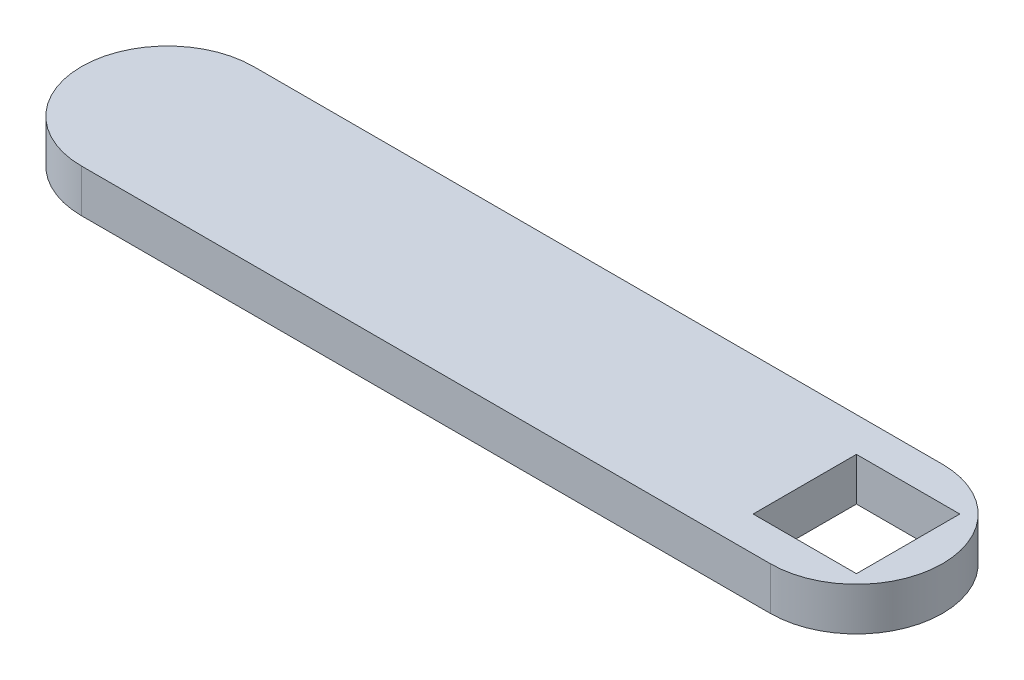
ISO-10303-21;
HEADER;
FILE_DESCRIPTION(('STEP AP214'),'2;1');
FILE_NAME('part.step','',(''),(''),'','','');
FILE_SCHEMA(('AUTOMOTIVE_DESIGN { 1 0 10303 214 1 1 1 1 }'));
ENDSEC;
DATA;
#1=APPLICATION_CONTEXT('core data for automotive mechanical design processes');
#2=APPLICATION_PROTOCOL_DEFINITION('international standard','automotive_design',2000,#1);
#3=PRODUCT_CONTEXT('',#1,'mechanical');
#4=PRODUCT('Part','Part','',(#3));
#5=PRODUCT_RELATED_PRODUCT_CATEGORY('part','',(#4));
#6=PRODUCT_DEFINITION_FORMATION('','',#4);
#7=PRODUCT_DEFINITION_CONTEXT('part definition',#1,'design');
#8=PRODUCT_DEFINITION('design','',#6,#7);
#9=PRODUCT_DEFINITION_SHAPE('','',#8);
#10=(LENGTH_UNIT() NAMED_UNIT(*) SI_UNIT(.MILLI.,.METRE.));
#11=(NAMED_UNIT(*) PLANE_ANGLE_UNIT() SI_UNIT($,.RADIAN.));
#12=(NAMED_UNIT(*) SI_UNIT($,.STERADIAN.) SOLID_ANGLE_UNIT());
#13=UNCERTAINTY_MEASURE_WITH_UNIT(LENGTH_MEASURE(1.E-05),#10,'distance_accuracy_value','');
#14=(GEOMETRIC_REPRESENTATION_CONTEXT(3) GLOBAL_UNCERTAINTY_ASSIGNED_CONTEXT((#13)) GLOBAL_UNIT_ASSIGNED_CONTEXT((#10,
#11,#12)) REPRESENTATION_CONTEXT('',''));
#15=CARTESIAN_POINT('',(0.,0.,0.));
#16=DIRECTION('',(0.,0.,1.));
#17=DIRECTION('',(1.,0.,0.));
#18=AXIS2_PLACEMENT_3D('',#15,#16,#17);
#19=CARTESIAN_POINT('',(-200.,25.,0.));
#20=DIRECTION('',(0.,-1.,0.));
#21=DIRECTION('',(0.,0.,-1.));
#22=AXIS2_PLACEMENT_3D('',#19,#20,#21);
#23=CYLINDRICAL_SURFACE('',#22,50.);
#24=CARTESIAN_POINT('',(-200.,0.,0.));
#25=DIRECTION('',(0.,1.,0.));
#26=DIRECTION('',(0.,0.,1.));
#27=AXIS2_PLACEMENT_3D('',#24,#25,#26);
#28=CIRCLE('',#27,50.);
#29=CARTESIAN_POINT('',(-200.,0.,-50.));
#30=VERTEX_POINT('',#29);
#31=CARTESIAN_POINT('',(-200.,0.,50.));
#32=VERTEX_POINT('',#31);
#33=EDGE_CURVE('E132',#30,#32,#28,.T.);
#34=ORIENTED_EDGE('',*,*,#33,.T.);
#35=DIRECTION('',(0.,-1.,0.));
#36=VECTOR('',#35,1.);
#37=CARTESIAN_POINT('',(-200.,25.,50.));
#38=LINE('',#37,#36);
#39=CARTESIAN_POINT('',(-200.,25.,50.));
#40=VERTEX_POINT('',#39);
#41=EDGE_CURVE('E11',#40,#32,#38,.T.);
#42=ORIENTED_EDGE('',*,*,#41,.F.);
#43=CARTESIAN_POINT('',(-200.,25.,0.));
#44=DIRECTION('',(0.,1.,0.));
#45=DIRECTION('',(0.,0.,1.));
#46=AXIS2_PLACEMENT_3D('',#43,#44,#45);
#47=CIRCLE('',#46,50.);
#48=CARTESIAN_POINT('',(-200.,25.,-50.));
#49=VERTEX_POINT('',#48);
#50=EDGE_CURVE('E136',#49,#40,#47,.T.);
#51=ORIENTED_EDGE('',*,*,#50,.F.);
#52=DIRECTION('',(0.,-1.,0.));
#53=VECTOR('',#52,1.);
#54=CARTESIAN_POINT('',(-200.,25.,-50.));
#55=LINE('',#54,#53);
#56=EDGE_CURVE('E146',#49,#30,#55,.T.);
#57=ORIENTED_EDGE('',*,*,#56,.T.);
#58=EDGE_LOOP('',(#34,#42,#51,#57));
#59=FACE_BOUND('',#58,.T.);
#60=ADVANCED_FACE('F35',(#59),#23,.T.);
#61=CARTESIAN_POINT('',(-200.,25.,50.));
#62=DIRECTION('',(0.,0.,-1.));
#63=DIRECTION('',(-1.,0.,0.));
#64=AXIS2_PLACEMENT_3D('',#61,#62,#63);
#65=PLANE('',#64);
#66=DIRECTION('',(1.,0.,0.));
#67=VECTOR('',#66,1.);
#68=CARTESIAN_POINT('',(-200.,0.,50.));
#69=LINE('',#68,#67);
#70=CARTESIAN_POINT('',(200.,0.,49.9999999999999));
#71=VERTEX_POINT('',#70);
#72=EDGE_CURVE('E149',#32,#71,#69,.T.);
#73=ORIENTED_EDGE('',*,*,#72,.T.);
#74=DIRECTION('',(0.,-1.,0.));
#75=VECTOR('',#74,1.);
#76=CARTESIAN_POINT('',(200.,25.,49.9999999999999));
#77=LINE('',#76,#75);
#78=CARTESIAN_POINT('',(200.,25.,49.9999999999999));
#79=VERTEX_POINT('',#78);
#80=EDGE_CURVE('E42',#79,#71,#77,.T.);
#81=ORIENTED_EDGE('',*,*,#80,.F.);
#82=DIRECTION('',(1.,0.,0.));
#83=VECTOR('',#82,1.);
#84=CARTESIAN_POINT('',(-200.,25.,50.));
#85=LINE('',#84,#83);
#86=EDGE_CURVE('E139',#40,#79,#85,.T.);
#87=ORIENTED_EDGE('',*,*,#86,.F.);
#88=ORIENTED_EDGE('',*,*,#41,.T.);
#89=EDGE_LOOP('',(#73,#81,#87,#88));
#90=FACE_BOUND('',#89,.T.);
#91=ADVANCED_FACE('F177',(#90),#65,.F.);
#92=CARTESIAN_POINT('',(200.,25.,0.));
#93=DIRECTION('',(0.,-1.,0.));
#94=DIRECTION('',(0.,0.,-1.));
#95=AXIS2_PLACEMENT_3D('',#92,#93,#94);
#96=CYLINDRICAL_SURFACE('',#95,50.);
#97=CARTESIAN_POINT('',(200.,0.,0.));
#98=DIRECTION('',(0.,1.,0.));
#99=DIRECTION('',(0.,0.,1.));
#100=AXIS2_PLACEMENT_3D('',#97,#98,#99);
#101=CIRCLE('',#100,50.);
#102=CARTESIAN_POINT('',(200.,0.,-50.0000000000001));
#103=VERTEX_POINT('',#102);
#104=EDGE_CURVE('E151',#71,#103,#101,.T.);
#105=ORIENTED_EDGE('',*,*,#104,.T.);
#106=DIRECTION('',(0.,-1.,0.));
#107=VECTOR('',#106,1.);
#108=CARTESIAN_POINT('',(200.,25.,-50.0000000000001));
#109=LINE('',#108,#107);
#110=CARTESIAN_POINT('',(200.,25.,-50.0000000000001));
#111=VERTEX_POINT('',#110);
#112=EDGE_CURVE('E156',#111,#103,#109,.T.);
#113=ORIENTED_EDGE('',*,*,#112,.F.);
#114=CARTESIAN_POINT('',(200.,25.,0.));
#115=DIRECTION('',(0.,1.,0.));
#116=DIRECTION('',(0.,0.,1.));
#117=AXIS2_PLACEMENT_3D('',#114,#115,#116);
#118=CIRCLE('',#117,50.);
#119=EDGE_CURVE('E142',#79,#111,#118,.T.);
#120=ORIENTED_EDGE('',*,*,#119,.F.);
#121=ORIENTED_EDGE('',*,*,#80,.T.);
#122=EDGE_LOOP('',(#105,#113,#120,#121));
#123=FACE_BOUND('',#122,.T.);
#124=ADVANCED_FACE('F163',(#123),#96,.T.);
#125=CARTESIAN_POINT('',(-200.,25.,-50.));
#126=DIRECTION('',(0.,0.,1.));
#127=DIRECTION('',(1.,0.,0.));
#128=AXIS2_PLACEMENT_3D('',#125,#126,#127);
#129=PLANE('',#128);
#130=DIRECTION('',(-1.,0.,0.));
#131=VECTOR('',#130,1.);
#132=CARTESIAN_POINT('',(-200.,0.,-50.));
#133=LINE('',#132,#131);
#134=EDGE_CURVE('E140',#103,#30,#133,.T.);
#135=ORIENTED_EDGE('',*,*,#134,.T.);
#136=ORIENTED_EDGE('',*,*,#56,.F.);
#137=DIRECTION('',(-1.,0.,0.));
#138=VECTOR('',#137,1.);
#139=CARTESIAN_POINT('',(-200.,25.,-50.));
#140=LINE('',#139,#138);
#141=EDGE_CURVE('E144',#111,#49,#140,.T.);
#142=ORIENTED_EDGE('',*,*,#141,.F.);
#143=ORIENTED_EDGE('',*,*,#112,.T.);
#144=EDGE_LOOP('',(#135,#136,#142,#143));
#145=FACE_BOUND('',#144,.T.);
#146=ADVANCED_FACE('F172',(#145),#129,.F.);
#147=CARTESIAN_POINT('',(-200.,25.,0.));
#148=DIRECTION('',(0.,1.,0.));
#149=DIRECTION('',(0.,0.,1.));
#150=AXIS2_PLACEMENT_3D('',#147,#148,#149);
#151=PLANE('',#150);
#152=DIRECTION('',(0.,0.,1.));
#153=VECTOR('',#152,1.);
#154=CARTESIAN_POINT('',(230.,25.,29.9999999999999));
#155=LINE('',#154,#153);
#156=CARTESIAN_POINT('',(230.,25.,-30.0000000000001));
#157=VERTEX_POINT('',#156);
#158=CARTESIAN_POINT('',(230.,25.,29.9999999999999));
#159=VERTEX_POINT('',#158);
#160=EDGE_CURVE('E101',#157,#159,#155,.T.);
#161=ORIENTED_EDGE('',*,*,#160,.T.);
#162=DIRECTION('',(-1.,0.,0.));
#163=VECTOR('',#162,1.);
#164=CARTESIAN_POINT('',(170.,25.,29.9999999999999));
#165=LINE('',#164,#163);
#166=CARTESIAN_POINT('',(170.,25.,29.9999999999999));
#167=VERTEX_POINT('',#166);
#168=EDGE_CURVE('E110',#159,#167,#165,.T.);
#169=ORIENTED_EDGE('',*,*,#168,.T.);
#170=DIRECTION('',(0.,0.,-1.));
#171=VECTOR('',#170,1.);
#172=CARTESIAN_POINT('',(170.,25.,29.9999999999999));
#173=LINE('',#172,#171);
#174=CARTESIAN_POINT('',(170.,25.,-30.0000000000001));
#175=VERTEX_POINT('',#174);
#176=EDGE_CURVE('E49',#167,#175,#173,.T.);
#177=ORIENTED_EDGE('',*,*,#176,.T.);
#178=DIRECTION('',(1.,0.,0.));
#179=VECTOR('',#178,1.);
#180=CARTESIAN_POINT('',(170.,25.,-30.0000000000001));
#181=LINE('',#180,#179);
#182=EDGE_CURVE('E107',#175,#157,#181,.T.);
#183=ORIENTED_EDGE('',*,*,#182,.T.);
#184=EDGE_LOOP('',(#161,#169,#177,#183));
#185=FACE_BOUND('',#184,.T.);
#186=ORIENTED_EDGE('',*,*,#50,.T.);
#187=ORIENTED_EDGE('',*,*,#86,.T.);
#188=ORIENTED_EDGE('',*,*,#119,.T.);
#189=ORIENTED_EDGE('',*,*,#141,.T.);
#190=EDGE_LOOP('',(#186,#187,#188,#189));
#191=FACE_BOUND('',#190,.T.);
#192=ADVANCED_FACE('F114',(#185,#191),#151,.T.);
#193=CARTESIAN_POINT('',(-200.,0.,0.));
#194=DIRECTION('',(0.,1.,0.));
#195=DIRECTION('',(0.,0.,1.));
#196=AXIS2_PLACEMENT_3D('',#193,#194,#195);
#197=PLANE('',#196);
#198=DIRECTION('',(-1.,0.,0.));
#199=VECTOR('',#198,1.);
#200=CARTESIAN_POINT('',(170.,0.,29.9999999999999));
#201=LINE('',#200,#199);
#202=CARTESIAN_POINT('',(230.,0.,29.9999999999999));
#203=VERTEX_POINT('',#202);
#204=CARTESIAN_POINT('',(170.,0.,29.9999999999999));
#205=VERTEX_POINT('',#204);
#206=EDGE_CURVE('E126',#203,#205,#201,.T.);
#207=ORIENTED_EDGE('',*,*,#206,.F.);
#208=DIRECTION('',(0.,0.,1.));
#209=VECTOR('',#208,1.);
#210=CARTESIAN_POINT('',(230.,0.,29.9999999999999));
#211=LINE('',#210,#209);
#212=CARTESIAN_POINT('',(230.,0.,-30.0000000000001));
#213=VERTEX_POINT('',#212);
#214=EDGE_CURVE('E57',#213,#203,#211,.T.);
#215=ORIENTED_EDGE('',*,*,#214,.F.);
#216=DIRECTION('',(1.,0.,0.));
#217=VECTOR('',#216,1.);
#218=CARTESIAN_POINT('',(170.,0.,-30.0000000000001));
#219=LINE('',#218,#217);
#220=CARTESIAN_POINT('',(170.,0.,-30.0000000000001));
#221=VERTEX_POINT('',#220);
#222=EDGE_CURVE('E117',#221,#213,#219,.T.);
#223=ORIENTED_EDGE('',*,*,#222,.F.);
#224=DIRECTION('',(0.,0.,-1.));
#225=VECTOR('',#224,1.);
#226=CARTESIAN_POINT('',(170.,0.,29.9999999999999));
#227=LINE('',#226,#225);
#228=EDGE_CURVE('E120',#205,#221,#227,.T.);
#229=ORIENTED_EDGE('',*,*,#228,.F.);
#230=EDGE_LOOP('',(#207,#215,#223,#229));
#231=FACE_BOUND('',#230,.T.);
#232=ORIENTED_EDGE('',*,*,#33,.F.);
#233=ORIENTED_EDGE('',*,*,#134,.F.);
#234=ORIENTED_EDGE('',*,*,#104,.F.);
#235=ORIENTED_EDGE('',*,*,#72,.F.);
#236=EDGE_LOOP('',(#232,#233,#234,#235));
#237=FACE_BOUND('',#236,.T.);
#238=ADVANCED_FACE('F169',(#231,#237),#197,.F.);
#239=CARTESIAN_POINT('',(230.,25.,29.9999999999999));
#240=DIRECTION('',(1.,0.,0.));
#241=DIRECTION('',(0.,0.,-1.));
#242=AXIS2_PLACEMENT_3D('',#239,#240,#241);
#243=PLANE('',#242);
#244=ORIENTED_EDGE('',*,*,#214,.T.);
#245=DIRECTION('',(0.,-1.,0.));
#246=VECTOR('',#245,1.);
#247=CARTESIAN_POINT('',(230.,25.,29.9999999999999));
#248=LINE('',#247,#246);
#249=EDGE_CURVE('E97',#159,#203,#248,.T.);
#250=ORIENTED_EDGE('',*,*,#249,.F.);
#251=ORIENTED_EDGE('',*,*,#160,.F.);
#252=DIRECTION('',(0.,-1.,0.));
#253=VECTOR('',#252,1.);
#254=CARTESIAN_POINT('',(230.,25.,-30.0000000000001));
#255=LINE('',#254,#253);
#256=EDGE_CURVE('E130',#157,#213,#255,.T.);
#257=ORIENTED_EDGE('',*,*,#256,.T.);
#258=EDGE_LOOP('',(#244,#250,#251,#257));
#259=FACE_BOUND('',#258,.T.);
#260=ADVANCED_FACE('F99',(#259),#243,.F.);
#261=CARTESIAN_POINT('',(170.,25.,-30.0000000000001));
#262=DIRECTION('',(0.,0.,-1.));
#263=DIRECTION('',(-1.,0.,0.));
#264=AXIS2_PLACEMENT_3D('',#261,#262,#263);
#265=PLANE('',#264);
#266=ORIENTED_EDGE('',*,*,#222,.T.);
#267=ORIENTED_EDGE('',*,*,#256,.F.);
#268=ORIENTED_EDGE('',*,*,#182,.F.);
#269=DIRECTION('',(0.,-1.,0.));
#270=VECTOR('',#269,1.);
#271=CARTESIAN_POINT('',(170.,25.,-30.0000000000001));
#272=LINE('',#271,#270);
#273=EDGE_CURVE('E133',#175,#221,#272,.T.);
#274=ORIENTED_EDGE('',*,*,#273,.T.);
#275=EDGE_LOOP('',(#266,#267,#268,#274));
#276=FACE_BOUND('',#275,.T.);
#277=ADVANCED_FACE('F194',(#276),#265,.F.);
#278=CARTESIAN_POINT('',(170.,25.,29.9999999999999));
#279=DIRECTION('',(-1.,0.,0.));
#280=DIRECTION('',(0.,0.,1.));
#281=AXIS2_PLACEMENT_3D('',#278,#279,#280);
#282=PLANE('',#281);
#283=ORIENTED_EDGE('',*,*,#228,.T.);
#284=ORIENTED_EDGE('',*,*,#273,.F.);
#285=ORIENTED_EDGE('',*,*,#176,.F.);
#286=DIRECTION('',(0.,-1.,0.));
#287=VECTOR('',#286,1.);
#288=CARTESIAN_POINT('',(170.,25.,29.9999999999999));
#289=LINE('',#288,#287);
#290=EDGE_CURVE('E106',#167,#205,#289,.T.);
#291=ORIENTED_EDGE('',*,*,#290,.T.);
#292=EDGE_LOOP('',(#283,#284,#285,#291));
#293=FACE_BOUND('',#292,.T.);
#294=ADVANCED_FACE('F197',(#293),#282,.F.);
#295=CARTESIAN_POINT('',(170.,25.,29.9999999999999));
#296=DIRECTION('',(0.,0.,1.));
#297=DIRECTION('',(1.,0.,0.));
#298=AXIS2_PLACEMENT_3D('',#295,#296,#297);
#299=PLANE('',#298);
#300=ORIENTED_EDGE('',*,*,#206,.T.);
#301=ORIENTED_EDGE('',*,*,#290,.F.);
#302=ORIENTED_EDGE('',*,*,#168,.F.);
#303=ORIENTED_EDGE('',*,*,#249,.T.);
#304=EDGE_LOOP('',(#300,#301,#302,#303));
#305=FACE_BOUND('',#304,.T.);
#306=ADVANCED_FACE('F111',(#305),#299,.F.);
#307=CLOSED_SHELL('',(#60,#91,#124,#146,#192,#238,#260,#277,#294,#306));
#308=MANIFOLD_SOLID_BREP('B2',#307);
#309=ADVANCED_BREP_SHAPE_REPRESENTATION('',(#18,#308),#14);
#310=SHAPE_DEFINITION_REPRESENTATION(#9,#309);
ENDSEC;
END-ISO-10303-21;
